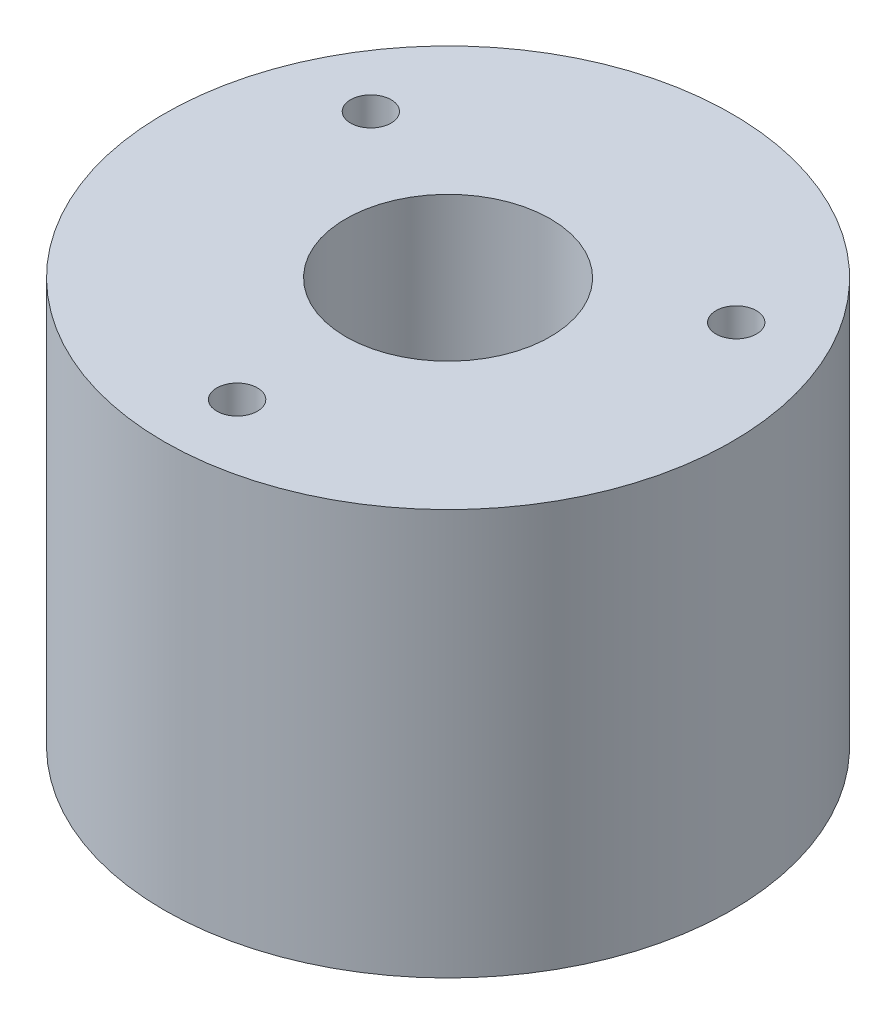
ISO-10303-21;
HEADER;
FILE_DESCRIPTION(('STEP AP214'),'2;1');
FILE_NAME('part.step','',(''),(''),'','','');
FILE_SCHEMA(('AUTOMOTIVE_DESIGN { 1 0 10303 214 1 1 1 1 }'));
ENDSEC;
DATA;
#1=APPLICATION_CONTEXT('core data for automotive mechanical design processes');
#2=APPLICATION_PROTOCOL_DEFINITION('international standard','automotive_design',2000,#1);
#3=PRODUCT_CONTEXT('',#1,'mechanical');
#4=PRODUCT('Part','Part','',(#3));
#5=PRODUCT_RELATED_PRODUCT_CATEGORY('part','',(#4));
#6=PRODUCT_DEFINITION_FORMATION('','',#4);
#7=PRODUCT_DEFINITION_CONTEXT('part definition',#1,'design');
#8=PRODUCT_DEFINITION('design','',#6,#7);
#9=PRODUCT_DEFINITION_SHAPE('','',#8);
#10=(LENGTH_UNIT() NAMED_UNIT(*) SI_UNIT(.MILLI.,.METRE.));
#11=(NAMED_UNIT(*) PLANE_ANGLE_UNIT() SI_UNIT($,.RADIAN.));
#12=(NAMED_UNIT(*) SI_UNIT($,.STERADIAN.) SOLID_ANGLE_UNIT());
#13=UNCERTAINTY_MEASURE_WITH_UNIT(LENGTH_MEASURE(1.E-05),#10,'distance_accuracy_value','');
#14=(GEOMETRIC_REPRESENTATION_CONTEXT(3) GLOBAL_UNCERTAINTY_ASSIGNED_CONTEXT((#13)) GLOBAL_UNIT_ASSIGNED_CONTEXT((#10,
#11,#12)) REPRESENTATION_CONTEXT('',''));
#15=CARTESIAN_POINT('',(0.,0.,0.));
#16=DIRECTION('',(0.,0.,1.));
#17=DIRECTION('',(1.,0.,0.));
#18=AXIS2_PLACEMENT_3D('',#15,#16,#17);
#19=CARTESIAN_POINT('',(0.,31.75,0.));
#20=DIRECTION('',(0.,-1.,0.));
#21=DIRECTION('',(0.,0.,-1.));
#22=AXIS2_PLACEMENT_3D('',#19,#20,#21);
#23=CYLINDRICAL_SURFACE('',#22,8.001);
#24=CARTESIAN_POINT('',(0.,31.75,0.));
#25=DIRECTION('',(0.,1.,0.));
#26=DIRECTION('',(0.,0.,1.));
#27=AXIS2_PLACEMENT_3D('',#24,#25,#26);
#28=CIRCLE('',#27,8.001);
#29=CARTESIAN_POINT('',(0.,31.75,8.001));
#30=VERTEX_POINT('',#29);
#31=EDGE_CURVE('E249',#30,#30,#28,.T.);
#32=ORIENTED_EDGE('',*,*,#31,.T.);
#33=EDGE_LOOP('',(#32));
#34=FACE_BOUND('',#33,.T.);
#35=CARTESIAN_POINT('',(0.,9.921875,0.));
#36=DIRECTION('',(0.,-1.,0.));
#37=DIRECTION('',(0.,0.,-1.));
#38=AXIS2_PLACEMENT_3D('',#35,#36,#37);
#39=CIRCLE('',#38,8.001);
#40=CARTESIAN_POINT('',(0.,9.921875,-8.001));
#41=VERTEX_POINT('',#40);
#42=EDGE_CURVE('E254',#41,#41,#39,.F.);
#43=ORIENTED_EDGE('',*,*,#42,.F.);
#44=EDGE_LOOP('',(#43));
#45=FACE_BOUND('',#44,.T.);
#46=ADVANCED_FACE('F45',(#34,#45),#23,.F.);
#47=CARTESIAN_POINT('',(0.,31.75,0.));
#48=DIRECTION('',(0.,1.,0.));
#49=DIRECTION('',(0.,0.,1.));
#50=AXIS2_PLACEMENT_3D('',#47,#48,#49);
#51=PLANE('',#50);
#52=CARTESIAN_POINT('',(0.,31.75,16.51));
#53=DIRECTION('',(0.,-1.,0.));
#54=DIRECTION('',(0.,0.,-1.));
#55=AXIS2_PLACEMENT_3D('',#52,#53,#54);
#56=CIRCLE('',#55,1.5875);
#57=CARTESIAN_POINT('',(0.,31.75,14.9225));
#58=VERTEX_POINT('',#57);
#59=EDGE_CURVE('E450',#58,#58,#56,.T.);
#60=ORIENTED_EDGE('',*,*,#59,.T.);
#61=EDGE_LOOP('',(#60));
#62=FACE_BOUND('',#61,.T.);
#63=CARTESIAN_POINT('',(14.2980794164811,31.75,-8.255));
#64=DIRECTION('',(0.,-1.,0.));
#65=DIRECTION('',(0.,0.,-1.));
#66=AXIS2_PLACEMENT_3D('',#63,#64,#65);
#67=CIRCLE('',#66,1.5875);
#68=CARTESIAN_POINT('',(14.2980794164811,31.75,-9.8425));
#69=VERTEX_POINT('',#68);
#70=EDGE_CURVE('E849',#69,#69,#67,.T.);
#71=ORIENTED_EDGE('',*,*,#70,.T.);
#72=EDGE_LOOP('',(#71));
#73=FACE_BOUND('',#72,.T.);
#74=CARTESIAN_POINT('',(-14.2980794164811,31.75,-8.25500000000001));
#75=DIRECTION('',(0.,-1.,0.));
#76=DIRECTION('',(0.,0.,-1.));
#77=AXIS2_PLACEMENT_3D('',#74,#75,#76);
#78=CIRCLE('',#77,1.5875);
#79=CARTESIAN_POINT('',(-14.2980794164811,31.75,-9.84250000000001));
#80=VERTEX_POINT('',#79);
#81=EDGE_CURVE('E858',#80,#80,#78,.T.);
#82=ORIENTED_EDGE('',*,*,#81,.T.);
#83=EDGE_LOOP('',(#82));
#84=FACE_BOUND('',#83,.T.);
#85=CARTESIAN_POINT('',(0.,31.75,0.));
#86=DIRECTION('',(0.,1.,0.));
#87=DIRECTION('',(0.,0.,1.));
#88=AXIS2_PLACEMENT_3D('',#85,#86,#87);
#89=CIRCLE('',#88,22.225);
#90=CARTESIAN_POINT('',(0.,31.75,22.225));
#91=VERTEX_POINT('',#90);
#92=EDGE_CURVE('E255',#91,#91,#89,.T.);
#93=ORIENTED_EDGE('',*,*,#92,.T.);
#94=EDGE_LOOP('',(#93));
#95=FACE_BOUND('',#94,.T.);
#96=ORIENTED_EDGE('',*,*,#31,.F.);
#97=EDGE_LOOP('',(#96));
#98=FACE_BOUND('',#97,.T.);
#99=ADVANCED_FACE('F504',(#62,#73,#84,#95,#98),#51,.T.);
#100=CARTESIAN_POINT('',(0.,0.,0.));
#101=DIRECTION('',(0.,1.,0.));
#102=DIRECTION('',(0.,0.,1.));
#103=AXIS2_PLACEMENT_3D('',#100,#101,#102);
#104=PLANE('',#103);
#105=CARTESIAN_POINT('',(0.,0.,16.51));
#106=DIRECTION('',(0.,-1.,0.));
#107=DIRECTION('',(0.,0.,-1.));
#108=AXIS2_PLACEMENT_3D('',#105,#106,#107);
#109=CIRCLE('',#108,1.5875);
#110=CARTESIAN_POINT('',(0.,0.,14.9225));
#111=VERTEX_POINT('',#110);
#112=EDGE_CURVE('E841',#111,#111,#109,.T.);
#113=ORIENTED_EDGE('',*,*,#112,.F.);
#114=EDGE_LOOP('',(#113));
#115=FACE_BOUND('',#114,.T.);
#116=CARTESIAN_POINT('',(14.2980794164811,0.,-8.255));
#117=DIRECTION('',(0.,-1.,0.));
#118=DIRECTION('',(0.,0.,-1.));
#119=AXIS2_PLACEMENT_3D('',#116,#117,#118);
#120=CIRCLE('',#119,1.5875);
#121=CARTESIAN_POINT('',(14.2980794164811,0.,-9.8425));
#122=VERTEX_POINT('',#121);
#123=EDGE_CURVE('E843',#122,#122,#120,.T.);
#124=ORIENTED_EDGE('',*,*,#123,.F.);
#125=EDGE_LOOP('',(#124));
#126=FACE_BOUND('',#125,.T.);
#127=CARTESIAN_POINT('',(-14.2980794164811,0.,-8.25500000000001));
#128=DIRECTION('',(0.,-1.,0.));
#129=DIRECTION('',(0.,0.,-1.));
#130=AXIS2_PLACEMENT_3D('',#127,#128,#129);
#131=CIRCLE('',#130,1.5875);
#132=CARTESIAN_POINT('',(-14.2980794164811,0.,-9.84250000000001));
#133=VERTEX_POINT('',#132);
#134=EDGE_CURVE('E855',#133,#133,#131,.T.);
#135=ORIENTED_EDGE('',*,*,#134,.F.);
#136=EDGE_LOOP('',(#135));
#137=FACE_BOUND('',#136,.T.);
#138=DIRECTION('',(0.5,0.,-0.866025403784439));
#139=VECTOR('',#138,1.);
#140=CARTESIAN_POINT('',(-10.38225,0.,-5.994194832294));
#141=LINE('',#140,#139);
#142=CARTESIAN_POINT('',(-12.0681210428597,0.,-3.07418053105195));
#143=VERTEX_POINT('',#142);
#144=CARTESIAN_POINT('',(-8.69637895714055,0.,-8.9142091335357));
#145=VERTEX_POINT('',#144);
#146=EDGE_CURVE('E225',#143,#145,#141,.T.);
#147=ORIENTED_EDGE('',*,*,#146,.F.);
#148=CARTESIAN_POINT('',(-14.8177516998752,0.,-4.66168053105195));
#149=DIRECTION('',(0.,1.,0.));
#150=DIRECTION('',(0.,0.,1.));
#151=AXIS2_PLACEMENT_3D('',#148,#149,#150);
#152=CIRCLE('',#151,3.175);
#153=CARTESIAN_POINT('',(-14.1679172332918,0.,-1.55389351035054));
#154=VERTEX_POINT('',#153);
#155=EDGE_CURVE('E207',#143,#154,#152,.F.);
#156=ORIENTED_EDGE('',*,*,#155,.T.);
#157=CARTESIAN_POINT('',(-13.843,0.,1.62196645003831E-13));
#158=DIRECTION('',(0.,-1.,0.));
#159=DIRECTION('',(0.,0.,-1.));
#160=AXIS2_PLACEMENT_3D('',#157,#158,#159);
#161=CIRCLE('',#160,1.5875);
#162=CARTESIAN_POINT('',(-14.1679172332917,0.,1.55389351035088));
#163=VERTEX_POINT('',#162);
#164=EDGE_CURVE('E238',#163,#154,#161,.T.);
#165=ORIENTED_EDGE('',*,*,#164,.F.);
#166=CARTESIAN_POINT('',(-14.817751699875,0.,4.66168053105232));
#167=DIRECTION('',(0.,1.,0.));
#168=DIRECTION('',(0.,0.,1.));
#169=AXIS2_PLACEMENT_3D('',#166,#167,#168);
#170=CIRCLE('',#169,3.175);
#171=CARTESIAN_POINT('',(-12.0681210428594,0.,3.07418053105233));
#172=VERTEX_POINT('',#171);
#173=EDGE_CURVE('E230',#163,#172,#170,.F.);
#174=ORIENTED_EDGE('',*,*,#173,.T.);
#175=DIRECTION('',(-0.5,0.,-0.866025403784439));
#176=VECTOR('',#175,1.);
#177=CARTESIAN_POINT('',(-10.38225,0.,5.99419483229399));
#178=LINE('',#177,#176);
#179=CARTESIAN_POINT('',(-8.69637895714046,0.,8.91420913353585));
#180=VERTEX_POINT('',#179);
#181=EDGE_CURVE('E245',#180,#172,#178,.T.);
#182=ORIENTED_EDGE('',*,*,#181,.F.);
#183=CARTESIAN_POINT('',(-11.4460096141561,0.,10.5017091335359));
#184=DIRECTION('',(0.,1.,0.));
#185=DIRECTION('',(0.,0.,1.));
#186=AXIS2_PLACEMENT_3D('',#183,#184,#185);
#187=CIRCLE('',#186,3.175);
#188=CARTESIAN_POINT('',(-8.42966987138535,0.,11.4928294875706));
#189=VERTEX_POINT('',#188);
#190=EDGE_CURVE('E266',#180,#189,#187,.F.);
#191=ORIENTED_EDGE('',*,*,#190,.T.);
#192=CARTESIAN_POINT('',(-6.9215,0.,11.988389664588));
#193=DIRECTION('',(0.,-1.,0.));
#194=DIRECTION('',(0.,0.,-1.));
#195=AXIS2_PLACEMENT_3D('',#192,#193,#194);
#196=CIRCLE('',#195,1.5875);
#197=CARTESIAN_POINT('',(-5.73824736190636,0.,13.0467229979213));
#198=VERTEX_POINT('',#197);
#199=EDGE_CURVE('E478',#198,#189,#196,.T.);
#200=ORIENTED_EDGE('',*,*,#199,.F.);
#201=CARTESIAN_POINT('',(-3.37174208571908,0.,15.163389664588));
#202=DIRECTION('',(0.,1.,0.));
#203=DIRECTION('',(0.,0.,1.));
#204=AXIS2_PLACEMENT_3D('',#201,#202,#203);
#205=CIRCLE('',#204,3.175);
#206=CARTESIAN_POINT('',(-3.37174208571908,0.,11.988389664588));
#207=VERTEX_POINT('',#206);
#208=EDGE_CURVE('E269',#198,#207,#205,.F.);
#209=ORIENTED_EDGE('',*,*,#208,.T.);
#210=DIRECTION('',(-1.,0.,0.));
#211=VECTOR('',#210,1.);
#212=CARTESIAN_POINT('',(0.,0.,11.988389664588));
#213=LINE('',#212,#211);
#214=CARTESIAN_POINT('',(3.37174208571913,0.,11.988389664588));
#215=VERTEX_POINT('',#214);
#216=EDGE_CURVE('E474',#215,#207,#213,.T.);
#217=ORIENTED_EDGE('',*,*,#216,.F.);
#218=CARTESIAN_POINT('',(3.37174208571913,0.,15.163389664588));
#219=DIRECTION('',(0.,1.,0.));
#220=DIRECTION('',(0.,0.,1.));
#221=AXIS2_PLACEMENT_3D('',#218,#219,#220);
#222=CIRCLE('',#221,3.175);
#223=CARTESIAN_POINT('',(5.73824736190639,0.,13.0467229979213));
#224=VERTEX_POINT('',#223);
#225=EDGE_CURVE('E272',#215,#224,#222,.F.);
#226=ORIENTED_EDGE('',*,*,#225,.T.);
#227=CARTESIAN_POINT('',(6.92150000000003,0.,11.988389664588));
#228=DIRECTION('',(0.,-1.,0.));
#229=DIRECTION('',(0.,0.,-1.));
#230=AXIS2_PLACEMENT_3D('',#227,#228,#229);
#231=CIRCLE('',#230,1.5875);
#232=CARTESIAN_POINT('',(8.42966987138538,0.,11.4928294875706));
#233=VERTEX_POINT('',#232);
#234=EDGE_CURVE('E470',#233,#224,#231,.T.);
#235=ORIENTED_EDGE('',*,*,#234,.F.);
#236=CARTESIAN_POINT('',(11.4460096141561,0.,10.5017091335358));
#237=DIRECTION('',(0.,1.,0.));
#238=DIRECTION('',(0.,0.,1.));
#239=AXIS2_PLACEMENT_3D('',#236,#237,#238);
#240=CIRCLE('',#239,3.175);
#241=CARTESIAN_POINT('',(8.69637895714048,0.,8.91420913353581));
#242=VERTEX_POINT('',#241);
#243=EDGE_CURVE('E275',#233,#242,#240,.F.);
#244=ORIENTED_EDGE('',*,*,#243,.T.);
#245=DIRECTION('',(-0.5,0.,0.866025403784439));
#246=VECTOR('',#245,1.);
#247=CARTESIAN_POINT('',(10.38225,0.,5.99419483229399));
#248=LINE('',#247,#246);
#249=CARTESIAN_POINT('',(12.0681210428596,0.,3.07418053105206));
#250=VERTEX_POINT('',#249);
#251=EDGE_CURVE('E466',#250,#242,#248,.T.);
#252=ORIENTED_EDGE('',*,*,#251,.F.);
#253=CARTESIAN_POINT('',(14.8177516998752,0.,4.66168053105206));
#254=DIRECTION('',(0.,1.,0.));
#255=DIRECTION('',(0.,0.,1.));
#256=AXIS2_PLACEMENT_3D('',#253,#254,#255);
#257=CIRCLE('',#256,3.175);
#258=CARTESIAN_POINT('',(14.1679172332917,0.,1.55389351035065));
#259=VERTEX_POINT('',#258);
#260=EDGE_CURVE('E278',#250,#259,#257,.F.);
#261=ORIENTED_EDGE('',*,*,#260,.T.);
#262=CARTESIAN_POINT('',(13.843,0.,0.));
#263=DIRECTION('',(0.,-1.,0.));
#264=DIRECTION('',(0.,0.,-1.));
#265=AXIS2_PLACEMENT_3D('',#262,#263,#264);
#266=CIRCLE('',#265,1.5875);
#267=CARTESIAN_POINT('',(14.1679172332917,0.,-1.55389351035078));
#268=VERTEX_POINT('',#267);
#269=EDGE_CURVE('E462',#268,#259,#266,.T.);
#270=ORIENTED_EDGE('',*,*,#269,.F.);
#271=CARTESIAN_POINT('',(14.8177516998751,0.,-4.66168053105221));
#272=DIRECTION('',(0.,1.,0.));
#273=DIRECTION('',(0.,0.,1.));
#274=AXIS2_PLACEMENT_3D('',#271,#272,#273);
#275=CIRCLE('',#274,3.175);
#276=CARTESIAN_POINT('',(12.0681210428595,0.,-3.07418053105221));
#277=VERTEX_POINT('',#276);
#278=EDGE_CURVE('E281',#268,#277,#275,.F.);
#279=ORIENTED_EDGE('',*,*,#278,.T.);
#280=DIRECTION('',(0.5,0.,0.866025403784439));
#281=VECTOR('',#280,1.);
#282=CARTESIAN_POINT('',(10.38225,0.,-5.99419483229399));
#283=LINE('',#282,#281);
#284=CARTESIAN_POINT('',(8.6963789571404,0.,-8.91420913353596));
#285=VERTEX_POINT('',#284);
#286=EDGE_CURVE('E458',#285,#277,#283,.T.);
#287=ORIENTED_EDGE('',*,*,#286,.F.);
#288=CARTESIAN_POINT('',(11.446009614156,0.,-10.501709133536));
#289=DIRECTION('',(0.,1.,0.));
#290=DIRECTION('',(0.,0.,1.));
#291=AXIS2_PLACEMENT_3D('',#288,#289,#290);
#292=CIRCLE('',#291,3.175);
#293=CARTESIAN_POINT('',(8.42966987138528,0.,-11.4928294875707));
#294=VERTEX_POINT('',#293);
#295=EDGE_CURVE('E284',#285,#294,#292,.F.);
#296=ORIENTED_EDGE('',*,*,#295,.T.);
#297=CARTESIAN_POINT('',(6.92149999999992,0.,-11.988389664588));
#298=DIRECTION('',(0.,-1.,0.));
#299=DIRECTION('',(0.,0.,-1.));
#300=AXIS2_PLACEMENT_3D('',#297,#298,#299);
#301=CIRCLE('',#300,1.5875);
#302=CARTESIAN_POINT('',(5.73824736190626,0.,-13.0467229979214));
#303=VERTEX_POINT('',#302);
#304=EDGE_CURVE('E454',#303,#294,#301,.T.);
#305=ORIENTED_EDGE('',*,*,#304,.F.);
#306=CARTESIAN_POINT('',(3.37174208571896,0.,-15.163389664588));
#307=DIRECTION('',(0.,1.,0.));
#308=DIRECTION('',(0.,0.,1.));
#309=AXIS2_PLACEMENT_3D('',#306,#307,#308);
#310=CIRCLE('',#309,3.175);
#311=CARTESIAN_POINT('',(3.37174208571896,0.,-11.988389664588));
#312=VERTEX_POINT('',#311);
#313=EDGE_CURVE('E287',#303,#312,#310,.F.);
#314=ORIENTED_EDGE('',*,*,#313,.T.);
#315=DIRECTION('',(1.,0.,0.));
#316=VECTOR('',#315,1.);
#317=CARTESIAN_POINT('',(0.,0.,-11.988389664588));
#318=LINE('',#317,#316);
#319=CARTESIAN_POINT('',(-3.37174208571925,0.,-11.988389664588));
#320=VERTEX_POINT('',#319);
#321=EDGE_CURVE('E449',#320,#312,#318,.T.);
#322=ORIENTED_EDGE('',*,*,#321,.F.);
#323=CARTESIAN_POINT('',(-3.37174208571925,0.,-15.163389664588));
#324=DIRECTION('',(0.,1.,0.));
#325=DIRECTION('',(0.,0.,1.));
#326=AXIS2_PLACEMENT_3D('',#323,#324,#325);
#327=CIRCLE('',#326,3.175);
#328=CARTESIAN_POINT('',(-5.73824736190649,0.,-13.0467229979213));
#329=VERTEX_POINT('',#328);
#330=EDGE_CURVE('E290',#320,#329,#327,.F.);
#331=ORIENTED_EDGE('',*,*,#330,.T.);
#332=CARTESIAN_POINT('',(-6.92150000000011,0.,-11.9883896645879));
#333=DIRECTION('',(0.,-1.,0.));
#334=DIRECTION('',(0.,0.,-1.));
#335=AXIS2_PLACEMENT_3D('',#332,#333,#334);
#336=CIRCLE('',#335,1.5875);
#337=CARTESIAN_POINT('',(-8.42966987138545,0.,-11.4928294875705));
#338=VERTEX_POINT('',#337);
#339=EDGE_CURVE('E445',#338,#329,#336,.T.);
#340=ORIENTED_EDGE('',*,*,#339,.F.);
#341=CARTESIAN_POINT('',(-11.4460096141561,0.,-10.5017091335357));
#342=DIRECTION('',(0.,1.,0.));
#343=DIRECTION('',(0.,0.,1.));
#344=AXIS2_PLACEMENT_3D('',#341,#342,#343);
#345=CIRCLE('',#344,3.175);
#346=EDGE_CURVE('E219',#338,#145,#345,.F.);
#347=ORIENTED_EDGE('',*,*,#346,.T.);
#348=EDGE_LOOP('',(#147,#156,#165,#174,#182,#191,#200,#209,#217,#226,#235,#244,#252,#261,#270,
#279,#287,#296,#305,#314,#322,#331,#340,#347));
#349=FACE_BOUND('',#348,.T.);
#350=CARTESIAN_POINT('',(0.,0.,0.));
#351=DIRECTION('',(0.,1.,0.));
#352=DIRECTION('',(0.,0.,1.));
#353=AXIS2_PLACEMENT_3D('',#350,#351,#352);
#354=CIRCLE('',#353,22.225);
#355=CARTESIAN_POINT('',(0.,0.,22.225));
#356=VERTEX_POINT('',#355);
#357=EDGE_CURVE('E253',#356,#356,#354,.T.);
#358=ORIENTED_EDGE('',*,*,#357,.F.);
#359=EDGE_LOOP('',(#358));
#360=FACE_BOUND('',#359,.T.);
#361=ADVANCED_FACE('F233',(#115,#126,#137,#349,#360),#104,.F.);
#362=CARTESIAN_POINT('',(0.,31.75,0.));
#363=DIRECTION('',(0.,-1.,0.));
#364=DIRECTION('',(0.,0.,-1.));
#365=AXIS2_PLACEMENT_3D('',#362,#363,#364);
#366=CYLINDRICAL_SURFACE('',#365,22.225);
#367=ORIENTED_EDGE('',*,*,#92,.F.);
#368=EDGE_LOOP('',(#367));
#369=FACE_BOUND('',#368,.T.);
#370=ORIENTED_EDGE('',*,*,#357,.T.);
#371=EDGE_LOOP('',(#370));
#372=FACE_BOUND('',#371,.T.);
#373=ADVANCED_FACE('F520',(#369,#372),#366,.T.);
#374=CARTESIAN_POINT('',(-6.92150000000011,9.921875,-11.9883896645879));
#375=DIRECTION('',(0.,-1.,0.));
#376=DIRECTION('',(0.,0.,-1.));
#377=AXIS2_PLACEMENT_3D('',#374,#375,#376);
#378=CYLINDRICAL_SURFACE('',#377,1.5875);
#379=CARTESIAN_POINT('',(-6.92150000000011,9.921875,-11.9883896645879));
#380=DIRECTION('',(0.,-1.,0.));
#381=DIRECTION('',(0.,0.,-1.));
#382=AXIS2_PLACEMENT_3D('',#379,#380,#381);
#383=CIRCLE('',#382,1.5875);
#384=CARTESIAN_POINT('',(-8.42966987138545,9.921875,-11.4928294875705));
#385=VERTEX_POINT('',#384);
#386=CARTESIAN_POINT('',(-5.73824736190649,9.921875,-13.0467229979213));
#387=VERTEX_POINT('',#386);
#388=EDGE_CURVE('E237',#385,#387,#383,.T.);
#389=ORIENTED_EDGE('',*,*,#388,.F.);
#390=DIRECTION('',(0.,-1.,0.));
#391=VECTOR('',#390,1.);
#392=CARTESIAN_POINT('',(-8.42966987138545,9.921875,-11.4928294875705));
#393=LINE('',#392,#391);
#394=EDGE_CURVE('E303',#385,#338,#393,.T.);
#395=ORIENTED_EDGE('',*,*,#394,.T.);
#396=ORIENTED_EDGE('',*,*,#339,.T.);
#397=DIRECTION('',(0.,-1.,0.));
#398=VECTOR('',#397,1.);
#399=CARTESIAN_POINT('',(-5.73824736190649,9.921875,-13.0467229979213));
#400=LINE('',#399,#398);
#401=EDGE_CURVE('E300',#329,#387,#400,.F.);
#402=ORIENTED_EDGE('',*,*,#401,.T.);
#403=EDGE_LOOP('',(#389,#395,#396,#402));
#404=FACE_BOUND('',#403,.T.);
#405=ADVANCED_FACE('F501',(#404),#378,.F.);
#406=CARTESIAN_POINT('',(-10.38225,9.921875,-5.994194832294));
#407=DIRECTION('',(-0.866025403784439,0.,-0.5));
#408=DIRECTION('',(-0.5,0.,0.866025403784439));
#409=AXIS2_PLACEMENT_3D('',#406,#407,#408);
#410=PLANE('',#409);
#411=DIRECTION('',(0.5,0.,-0.866025403784439));
#412=VECTOR('',#411,1.);
#413=CARTESIAN_POINT('',(-10.38225,9.921875,-5.994194832294));
#414=LINE('',#413,#412);
#415=CARTESIAN_POINT('',(-12.0681210428597,9.921875,-3.07418053105195));
#416=VERTEX_POINT('',#415);
#417=CARTESIAN_POINT('',(-8.69637895714055,9.921875,-8.9142091335357));
#418=VERTEX_POINT('',#417);
#419=EDGE_CURVE('E228',#416,#418,#414,.T.);
#420=ORIENTED_EDGE('',*,*,#419,.F.);
#421=DIRECTION('',(0.,-1.,0.));
#422=VECTOR('',#421,1.);
#423=CARTESIAN_POINT('',(-12.0681210428597,9.921875,-3.07418053105195));
#424=LINE('',#423,#422);
#425=EDGE_CURVE('E211',#416,#143,#424,.T.);
#426=ORIENTED_EDGE('',*,*,#425,.T.);
#427=ORIENTED_EDGE('',*,*,#146,.T.);
#428=DIRECTION('',(0.,-1.,0.));
#429=VECTOR('',#428,1.);
#430=CARTESIAN_POINT('',(-8.69637895714055,9.921875,-8.9142091335357));
#431=LINE('',#430,#429);
#432=EDGE_CURVE('E231',#145,#418,#431,.F.);
#433=ORIENTED_EDGE('',*,*,#432,.T.);
#434=EDGE_LOOP('',(#420,#426,#427,#433));
#435=FACE_BOUND('',#434,.T.);
#436=ADVANCED_FACE('F224',(#435),#410,.F.);
#437=CARTESIAN_POINT('',(-13.843,9.921875,1.62196645003831E-13));
#438=DIRECTION('',(0.,-1.,0.));
#439=DIRECTION('',(0.,0.,-1.));
#440=AXIS2_PLACEMENT_3D('',#437,#438,#439);
#441=CYLINDRICAL_SURFACE('',#440,1.5875);
#442=ORIENTED_EDGE('',*,*,#164,.T.);
#443=DIRECTION('',(0.,-1.,0.));
#444=VECTOR('',#443,1.);
#445=CARTESIAN_POINT('',(-14.1679172332918,9.921875,-1.55389351035054));
#446=LINE('',#445,#444);
#447=CARTESIAN_POINT('',(-14.1679172332918,9.921875,-1.55389351035054));
#448=VERTEX_POINT('',#447);
#449=EDGE_CURVE('E212',#154,#448,#446,.F.);
#450=ORIENTED_EDGE('',*,*,#449,.T.);
#451=CARTESIAN_POINT('',(-13.843,9.921875,1.62196645003831E-13));
#452=DIRECTION('',(0.,-1.,0.));
#453=DIRECTION('',(0.,0.,-1.));
#454=AXIS2_PLACEMENT_3D('',#451,#452,#453);
#455=CIRCLE('',#454,1.5875);
#456=CARTESIAN_POINT('',(-14.1679172332917,9.921875,1.55389351035088));
#457=VERTEX_POINT('',#456);
#458=EDGE_CURVE('E404',#457,#448,#455,.T.);
#459=ORIENTED_EDGE('',*,*,#458,.F.);
#460=DIRECTION('',(0.,-1.,0.));
#461=VECTOR('',#460,1.);
#462=CARTESIAN_POINT('',(-14.1679172332917,9.921875,1.55389351035088));
#463=LINE('',#462,#461);
#464=EDGE_CURVE('E218',#457,#163,#463,.T.);
#465=ORIENTED_EDGE('',*,*,#464,.T.);
#466=EDGE_LOOP('',(#442,#450,#459,#465));
#467=FACE_BOUND('',#466,.T.);
#468=ADVANCED_FACE('F492',(#467),#441,.F.);
#469=CARTESIAN_POINT('',(-10.38225,9.921875,5.99419483229399));
#470=DIRECTION('',(-0.866025403784439,0.,0.5));
#471=DIRECTION('',(0.5,0.,0.866025403784439));
#472=AXIS2_PLACEMENT_3D('',#469,#470,#471);
#473=PLANE('',#472);
#474=DIRECTION('',(-0.5,0.,-0.866025403784439));
#475=VECTOR('',#474,1.);
#476=CARTESIAN_POINT('',(-10.38225,9.921875,5.99419483229399));
#477=LINE('',#476,#475);
#478=CARTESIAN_POINT('',(-8.69637895714046,9.921875,8.91420913353585));
#479=VERTEX_POINT('',#478);
#480=CARTESIAN_POINT('',(-12.0681210428594,9.921875,3.07418053105233));
#481=VERTEX_POINT('',#480);
#482=EDGE_CURVE('E408',#479,#481,#477,.T.);
#483=ORIENTED_EDGE('',*,*,#482,.F.);
#484=DIRECTION('',(0.,-1.,0.));
#485=VECTOR('',#484,1.);
#486=CARTESIAN_POINT('',(-8.69637895714046,9.921875,8.91420913353585));
#487=LINE('',#486,#485);
#488=EDGE_CURVE('E365',#479,#180,#487,.T.);
#489=ORIENTED_EDGE('',*,*,#488,.T.);
#490=ORIENTED_EDGE('',*,*,#181,.T.);
#491=DIRECTION('',(0.,-1.,0.));
#492=VECTOR('',#491,1.);
#493=CARTESIAN_POINT('',(-12.0681210428594,9.921875,3.07418053105233));
#494=LINE('',#493,#492);
#495=EDGE_CURVE('E61',#172,#481,#494,.F.);
#496=ORIENTED_EDGE('',*,*,#495,.T.);
#497=EDGE_LOOP('',(#483,#489,#490,#496));
#498=FACE_BOUND('',#497,.T.);
#499=ADVANCED_FACE('F483',(#498),#473,.F.);
#500=CARTESIAN_POINT('',(-6.9215,9.921875,11.988389664588));
#501=DIRECTION('',(0.,-1.,0.));
#502=DIRECTION('',(0.,0.,-1.));
#503=AXIS2_PLACEMENT_3D('',#500,#501,#502);
#504=CYLINDRICAL_SURFACE('',#503,1.5875);
#505=CARTESIAN_POINT('',(-6.9215,9.921875,11.988389664588));
#506=DIRECTION('',(0.,-1.,0.));
#507=DIRECTION('',(0.,0.,-1.));
#508=AXIS2_PLACEMENT_3D('',#505,#506,#507);
#509=CIRCLE('',#508,1.5875);
#510=CARTESIAN_POINT('',(-5.73824736190636,9.921875,13.0467229979213));
#511=VERTEX_POINT('',#510);
#512=CARTESIAN_POINT('',(-8.42966987138535,9.921875,11.4928294875706));
#513=VERTEX_POINT('',#512);
#514=EDGE_CURVE('E411',#511,#513,#509,.T.);
#515=ORIENTED_EDGE('',*,*,#514,.F.);
#516=DIRECTION('',(0.,-1.,0.));
#517=VECTOR('',#516,1.);
#518=CARTESIAN_POINT('',(-5.73824736190636,9.921875,13.0467229979213));
#519=LINE('',#518,#517);
#520=EDGE_CURVE('E359',#511,#198,#519,.T.);
#521=ORIENTED_EDGE('',*,*,#520,.T.);
#522=ORIENTED_EDGE('',*,*,#199,.T.);
#523=DIRECTION('',(0.,-1.,0.));
#524=VECTOR('',#523,1.);
#525=CARTESIAN_POINT('',(-8.42966987138535,9.921875,11.4928294875706));
#526=LINE('',#525,#524);
#527=EDGE_CURVE('E356',#189,#513,#526,.F.);
#528=ORIENTED_EDGE('',*,*,#527,.T.);
#529=EDGE_LOOP('',(#515,#521,#522,#528));
#530=FACE_BOUND('',#529,.T.);
#531=ADVANCED_FACE('F499',(#530),#504,.F.);
#532=CARTESIAN_POINT('',(0.,9.921875,11.988389664588));
#533=DIRECTION('',(0.,0.,1.));
#534=DIRECTION('',(1.,0.,0.));
#535=AXIS2_PLACEMENT_3D('',#532,#533,#534);
#536=PLANE('',#535);
#537=DIRECTION('',(-1.,0.,0.));
#538=VECTOR('',#537,1.);
#539=CARTESIAN_POINT('',(0.,9.921875,11.988389664588));
#540=LINE('',#539,#538);
#541=CARTESIAN_POINT('',(3.37174208571913,9.921875,11.988389664588));
#542=VERTEX_POINT('',#541);
#543=CARTESIAN_POINT('',(-3.37174208571908,9.921875,11.988389664588));
#544=VERTEX_POINT('',#543);
#545=EDGE_CURVE('E414',#542,#544,#540,.T.);
#546=ORIENTED_EDGE('',*,*,#545,.F.);
#547=DIRECTION('',(0.,-1.,0.));
#548=VECTOR('',#547,1.);
#549=CARTESIAN_POINT('',(3.37174208571913,9.921875,11.988389664588));
#550=LINE('',#549,#548);
#551=EDGE_CURVE('E352',#542,#215,#550,.T.);
#552=ORIENTED_EDGE('',*,*,#551,.T.);
#553=ORIENTED_EDGE('',*,*,#216,.T.);
#554=DIRECTION('',(0.,-1.,0.));
#555=VECTOR('',#554,1.);
#556=CARTESIAN_POINT('',(-3.37174208571908,9.921875,11.988389664588));
#557=LINE('',#556,#555);
#558=EDGE_CURVE('E349',#207,#544,#557,.F.);
#559=ORIENTED_EDGE('',*,*,#558,.T.);
#560=EDGE_LOOP('',(#546,#552,#553,#559));
#561=FACE_BOUND('',#560,.T.);
#562=ADVANCED_FACE('F578',(#561),#536,.F.);
#563=CARTESIAN_POINT('',(6.92150000000003,9.921875,11.988389664588));
#564=DIRECTION('',(0.,-1.,0.));
#565=DIRECTION('',(0.,0.,-1.));
#566=AXIS2_PLACEMENT_3D('',#563,#564,#565);
#567=CYLINDRICAL_SURFACE('',#566,1.5875);
#568=CARTESIAN_POINT('',(6.92150000000003,9.921875,11.988389664588));
#569=DIRECTION('',(0.,-1.,0.));
#570=DIRECTION('',(0.,0.,-1.));
#571=AXIS2_PLACEMENT_3D('',#568,#569,#570);
#572=CIRCLE('',#571,1.5875);
#573=CARTESIAN_POINT('',(8.42966987138538,9.921875,11.4928294875706));
#574=VERTEX_POINT('',#573);
#575=CARTESIAN_POINT('',(5.73824736190639,9.921875,13.0467229979213));
#576=VERTEX_POINT('',#575);
#577=EDGE_CURVE('E418',#574,#576,#572,.T.);
#578=ORIENTED_EDGE('',*,*,#577,.F.);
#579=DIRECTION('',(0.,-1.,0.));
#580=VECTOR('',#579,1.);
#581=CARTESIAN_POINT('',(8.42966987138538,9.921875,11.4928294875706));
#582=LINE('',#581,#580);
#583=EDGE_CURVE('E345',#574,#233,#582,.T.);
#584=ORIENTED_EDGE('',*,*,#583,.T.);
#585=ORIENTED_EDGE('',*,*,#234,.T.);
#586=DIRECTION('',(0.,-1.,0.));
#587=VECTOR('',#586,1.);
#588=CARTESIAN_POINT('',(5.7382473619064,9.921875,13.0467229979213));
#589=LINE('',#588,#587);
#590=EDGE_CURVE('E342',#224,#576,#589,.F.);
#591=ORIENTED_EDGE('',*,*,#590,.T.);
#592=EDGE_LOOP('',(#578,#584,#585,#591));
#593=FACE_BOUND('',#592,.T.);
#594=ADVANCED_FACE('F585',(#593),#567,.F.);
#595=CARTESIAN_POINT('',(10.38225,9.921875,5.99419483229399));
#596=DIRECTION('',(0.866025403784439,0.,0.5));
#597=DIRECTION('',(0.5,0.,-0.866025403784439));
#598=AXIS2_PLACEMENT_3D('',#595,#596,#597);
#599=PLANE('',#598);
#600=DIRECTION('',(-0.5,0.,0.866025403784439));
#601=VECTOR('',#600,1.);
#602=CARTESIAN_POINT('',(10.38225,9.921875,5.99419483229399));
#603=LINE('',#602,#601);
#604=CARTESIAN_POINT('',(12.0681210428596,9.921875,3.07418053105206));
#605=VERTEX_POINT('',#604);
#606=CARTESIAN_POINT('',(8.69637895714048,9.921875,8.91420913353581));
#607=VERTEX_POINT('',#606);
#608=EDGE_CURVE('E422',#605,#607,#603,.T.);
#609=ORIENTED_EDGE('',*,*,#608,.F.);
#610=DIRECTION('',(0.,-1.,0.));
#611=VECTOR('',#610,1.);
#612=CARTESIAN_POINT('',(12.0681210428596,9.921875,3.07418053105206));
#613=LINE('',#612,#611);
#614=EDGE_CURVE('E338',#605,#250,#613,.T.);
#615=ORIENTED_EDGE('',*,*,#614,.T.);
#616=ORIENTED_EDGE('',*,*,#251,.T.);
#617=DIRECTION('',(0.,-1.,0.));
#618=VECTOR('',#617,1.);
#619=CARTESIAN_POINT('',(8.69637895714048,9.921875,8.91420913353581));
#620=LINE('',#619,#618);
#621=EDGE_CURVE('E335',#242,#607,#620,.F.);
#622=ORIENTED_EDGE('',*,*,#621,.T.);
#623=EDGE_LOOP('',(#609,#615,#616,#622));
#624=FACE_BOUND('',#623,.T.);
#625=ADVANCED_FACE('F592',(#624),#599,.F.);
#626=CARTESIAN_POINT('',(13.843,9.921875,0.));
#627=DIRECTION('',(0.,-1.,0.));
#628=DIRECTION('',(0.,0.,-1.));
#629=AXIS2_PLACEMENT_3D('',#626,#627,#628);
#630=CYLINDRICAL_SURFACE('',#629,1.5875);
#631=CARTESIAN_POINT('',(13.843,9.921875,0.));
#632=DIRECTION('',(0.,-1.,0.));
#633=DIRECTION('',(0.,0.,-1.));
#634=AXIS2_PLACEMENT_3D('',#631,#632,#633);
#635=CIRCLE('',#634,1.5875);
#636=CARTESIAN_POINT('',(14.1679172332917,9.921875,-1.55389351035078));
#637=VERTEX_POINT('',#636);
#638=CARTESIAN_POINT('',(14.1679172332917,9.921875,1.55389351035065));
#639=VERTEX_POINT('',#638);
#640=EDGE_CURVE('E426',#637,#639,#635,.T.);
#641=ORIENTED_EDGE('',*,*,#640,.F.);
#642=DIRECTION('',(0.,-1.,0.));
#643=VECTOR('',#642,1.);
#644=CARTESIAN_POINT('',(14.1679172332917,9.921875,-1.55389351035078));
#645=LINE('',#644,#643);
#646=EDGE_CURVE('E331',#637,#268,#645,.T.);
#647=ORIENTED_EDGE('',*,*,#646,.T.);
#648=ORIENTED_EDGE('',*,*,#269,.T.);
#649=DIRECTION('',(0.,-1.,0.));
#650=VECTOR('',#649,1.);
#651=CARTESIAN_POINT('',(14.1679172332917,9.921875,1.55389351035065));
#652=LINE('',#651,#650);
#653=EDGE_CURVE('E328',#259,#639,#652,.F.);
#654=ORIENTED_EDGE('',*,*,#653,.T.);
#655=EDGE_LOOP('',(#641,#647,#648,#654));
#656=FACE_BOUND('',#655,.T.);
#657=ADVANCED_FACE('F599',(#656),#630,.F.);
#658=CARTESIAN_POINT('',(10.38225,9.921875,-5.99419483229399));
#659=DIRECTION('',(0.866025403784439,0.,-0.5));
#660=DIRECTION('',(-0.5,0.,-0.866025403784439));
#661=AXIS2_PLACEMENT_3D('',#658,#659,#660);
#662=PLANE('',#661);
#663=DIRECTION('',(0.5,0.,0.866025403784439));
#664=VECTOR('',#663,1.);
#665=CARTESIAN_POINT('',(10.38225,9.921875,-5.99419483229399));
#666=LINE('',#665,#664);
#667=CARTESIAN_POINT('',(8.6963789571404,9.921875,-8.91420913353596));
#668=VERTEX_POINT('',#667);
#669=CARTESIAN_POINT('',(12.0681210428595,9.921875,-3.07418053105221));
#670=VERTEX_POINT('',#669);
#671=EDGE_CURVE('E430',#668,#670,#666,.T.);
#672=ORIENTED_EDGE('',*,*,#671,.F.);
#673=DIRECTION('',(0.,-1.,0.));
#674=VECTOR('',#673,1.);
#675=CARTESIAN_POINT('',(8.6963789571404,9.921875,-8.91420913353596));
#676=LINE('',#675,#674);
#677=EDGE_CURVE('E324',#668,#285,#676,.T.);
#678=ORIENTED_EDGE('',*,*,#677,.T.);
#679=ORIENTED_EDGE('',*,*,#286,.T.);
#680=DIRECTION('',(0.,-1.,0.));
#681=VECTOR('',#680,1.);
#682=CARTESIAN_POINT('',(12.0681210428595,9.921875,-3.07418053105221));
#683=LINE('',#682,#681);
#684=EDGE_CURVE('E321',#277,#670,#683,.F.);
#685=ORIENTED_EDGE('',*,*,#684,.T.);
#686=EDGE_LOOP('',(#672,#678,#679,#685));
#687=FACE_BOUND('',#686,.T.);
#688=ADVANCED_FACE('F606',(#687),#662,.F.);
#689=CARTESIAN_POINT('',(6.92149999999992,9.921875,-11.988389664588));
#690=DIRECTION('',(0.,-1.,0.));
#691=DIRECTION('',(0.,0.,-1.));
#692=AXIS2_PLACEMENT_3D('',#689,#690,#691);
#693=CYLINDRICAL_SURFACE('',#692,1.5875);
#694=CARTESIAN_POINT('',(6.92149999999992,9.921875,-11.988389664588));
#695=DIRECTION('',(0.,-1.,0.));
#696=DIRECTION('',(0.,0.,-1.));
#697=AXIS2_PLACEMENT_3D('',#694,#695,#696);
#698=CIRCLE('',#697,1.5875);
#699=CARTESIAN_POINT('',(5.73824736190626,9.921875,-13.0467229979214));
#700=VERTEX_POINT('',#699);
#701=CARTESIAN_POINT('',(8.42966987138528,9.921875,-11.4928294875707));
#702=VERTEX_POINT('',#701);
#703=EDGE_CURVE('E434',#700,#702,#698,.T.);
#704=ORIENTED_EDGE('',*,*,#703,.F.);
#705=DIRECTION('',(0.,-1.,0.));
#706=VECTOR('',#705,1.);
#707=CARTESIAN_POINT('',(5.73824736190627,9.921875,-13.0467229979214));
#708=LINE('',#707,#706);
#709=EDGE_CURVE('E317',#700,#303,#708,.T.);
#710=ORIENTED_EDGE('',*,*,#709,.T.);
#711=ORIENTED_EDGE('',*,*,#304,.T.);
#712=DIRECTION('',(0.,-1.,0.));
#713=VECTOR('',#712,1.);
#714=CARTESIAN_POINT('',(8.42966987138528,9.921875,-11.4928294875707));
#715=LINE('',#714,#713);
#716=EDGE_CURVE('E314',#294,#702,#715,.F.);
#717=ORIENTED_EDGE('',*,*,#716,.T.);
#718=EDGE_LOOP('',(#704,#710,#711,#717));
#719=FACE_BOUND('',#718,.T.);
#720=ADVANCED_FACE('F613',(#719),#693,.F.);
#721=CARTESIAN_POINT('',(0.,9.921875,-11.988389664588));
#722=DIRECTION('',(0.,0.,-1.));
#723=DIRECTION('',(-1.,0.,0.));
#724=AXIS2_PLACEMENT_3D('',#721,#722,#723);
#725=PLANE('',#724);
#726=DIRECTION('',(1.,0.,0.));
#727=VECTOR('',#726,1.);
#728=CARTESIAN_POINT('',(0.,9.921875,-11.988389664588));
#729=LINE('',#728,#727);
#730=CARTESIAN_POINT('',(-3.37174208571925,9.921875,-11.988389664588));
#731=VERTEX_POINT('',#730);
#732=CARTESIAN_POINT('',(3.37174208571896,9.921875,-11.988389664588));
#733=VERTEX_POINT('',#732);
#734=EDGE_CURVE('E243',#731,#733,#729,.T.);
#735=ORIENTED_EDGE('',*,*,#734,.F.);
#736=DIRECTION('',(0.,-1.,0.));
#737=VECTOR('',#736,1.);
#738=CARTESIAN_POINT('',(-3.37174208571925,9.921875,-11.988389664588));
#739=LINE('',#738,#737);
#740=EDGE_CURVE('E310',#731,#320,#739,.T.);
#741=ORIENTED_EDGE('',*,*,#740,.T.);
#742=ORIENTED_EDGE('',*,*,#321,.T.);
#743=DIRECTION('',(0.,-1.,0.));
#744=VECTOR('',#743,1.);
#745=CARTESIAN_POINT('',(3.37174208571896,9.921875,-11.988389664588));
#746=LINE('',#745,#744);
#747=EDGE_CURVE('E307',#312,#733,#746,.F.);
#748=ORIENTED_EDGE('',*,*,#747,.T.);
#749=EDGE_LOOP('',(#735,#741,#742,#748));
#750=FACE_BOUND('',#749,.T.);
#751=ADVANCED_FACE('F618',(#750),#725,.F.);
#752=CARTESIAN_POINT('',(0.,9.921875,0.));
#753=DIRECTION('',(0.,-1.,0.));
#754=DIRECTION('',(0.,0.,-1.));
#755=AXIS2_PLACEMENT_3D('',#752,#753,#754);
#756=PLANE('',#755);
#757=ORIENTED_EDGE('',*,*,#419,.T.);
#758=CARTESIAN_POINT('',(-11.4460096141561,9.921875,-10.5017091335357));
#759=DIRECTION('',(0.,-1.,0.));
#760=DIRECTION('',(0.,0.,-1.));
#761=AXIS2_PLACEMENT_3D('',#758,#759,#760);
#762=CIRCLE('',#761,3.175);
#763=EDGE_CURVE('E372',#418,#385,#762,.F.);
#764=ORIENTED_EDGE('',*,*,#763,.T.);
#765=ORIENTED_EDGE('',*,*,#388,.T.);
#766=CARTESIAN_POINT('',(-3.37174208571925,9.921875,-15.163389664588));
#767=DIRECTION('',(0.,-1.,0.));
#768=DIRECTION('',(0.,0.,-1.));
#769=AXIS2_PLACEMENT_3D('',#766,#767,#768);
#770=CIRCLE('',#769,3.175);
#771=EDGE_CURVE('E375',#387,#731,#770,.F.);
#772=ORIENTED_EDGE('',*,*,#771,.T.);
#773=ORIENTED_EDGE('',*,*,#734,.T.);
#774=CARTESIAN_POINT('',(3.37174208571896,9.921875,-15.163389664588));
#775=DIRECTION('',(0.,-1.,0.));
#776=DIRECTION('',(0.,0.,-1.));
#777=AXIS2_PLACEMENT_3D('',#774,#775,#776);
#778=CIRCLE('',#777,3.175);
#779=EDGE_CURVE('E378',#733,#700,#778,.F.);
#780=ORIENTED_EDGE('',*,*,#779,.T.);
#781=ORIENTED_EDGE('',*,*,#703,.T.);
#782=CARTESIAN_POINT('',(11.446009614156,9.921875,-10.501709133536));
#783=DIRECTION('',(0.,-1.,0.));
#784=DIRECTION('',(0.,0.,-1.));
#785=AXIS2_PLACEMENT_3D('',#782,#783,#784);
#786=CIRCLE('',#785,3.175);
#787=EDGE_CURVE('E381',#702,#668,#786,.F.);
#788=ORIENTED_EDGE('',*,*,#787,.T.);
#789=ORIENTED_EDGE('',*,*,#671,.T.);
#790=CARTESIAN_POINT('',(14.8177516998751,9.921875,-4.66168053105221));
#791=DIRECTION('',(0.,-1.,0.));
#792=DIRECTION('',(0.,0.,-1.));
#793=AXIS2_PLACEMENT_3D('',#790,#791,#792);
#794=CIRCLE('',#793,3.175);
#795=EDGE_CURVE('E384',#670,#637,#794,.F.);
#796=ORIENTED_EDGE('',*,*,#795,.T.);
#797=ORIENTED_EDGE('',*,*,#640,.T.);
#798=CARTESIAN_POINT('',(14.8177516998752,9.921875,4.66168053105206));
#799=DIRECTION('',(0.,-1.,0.));
#800=DIRECTION('',(0.,0.,-1.));
#801=AXIS2_PLACEMENT_3D('',#798,#799,#800);
#802=CIRCLE('',#801,3.175);
#803=EDGE_CURVE('E387',#639,#605,#802,.F.);
#804=ORIENTED_EDGE('',*,*,#803,.T.);
#805=ORIENTED_EDGE('',*,*,#608,.T.);
#806=CARTESIAN_POINT('',(11.4460096141561,9.921875,10.5017091335358));
#807=DIRECTION('',(0.,-1.,0.));
#808=DIRECTION('',(0.,0.,-1.));
#809=AXIS2_PLACEMENT_3D('',#806,#807,#808);
#810=CIRCLE('',#809,3.175);
#811=EDGE_CURVE('E390',#607,#574,#810,.F.);
#812=ORIENTED_EDGE('',*,*,#811,.T.);
#813=ORIENTED_EDGE('',*,*,#577,.T.);
#814=CARTESIAN_POINT('',(3.37174208571913,9.921875,15.163389664588));
#815=DIRECTION('',(0.,-1.,0.));
#816=DIRECTION('',(0.,0.,-1.));
#817=AXIS2_PLACEMENT_3D('',#814,#815,#816);
#818=CIRCLE('',#817,3.175);
#819=EDGE_CURVE('E393',#576,#542,#818,.F.);
#820=ORIENTED_EDGE('',*,*,#819,.T.);
#821=ORIENTED_EDGE('',*,*,#545,.T.);
#822=CARTESIAN_POINT('',(-3.37174208571908,9.921875,15.163389664588));
#823=DIRECTION('',(0.,-1.,0.));
#824=DIRECTION('',(0.,0.,-1.));
#825=AXIS2_PLACEMENT_3D('',#822,#823,#824);
#826=CIRCLE('',#825,3.175);
#827=EDGE_CURVE('E396',#544,#511,#826,.F.);
#828=ORIENTED_EDGE('',*,*,#827,.T.);
#829=ORIENTED_EDGE('',*,*,#514,.T.);
#830=CARTESIAN_POINT('',(-11.4460096141561,9.921875,10.5017091335359));
#831=DIRECTION('',(0.,-1.,0.));
#832=DIRECTION('',(0.,0.,-1.));
#833=AXIS2_PLACEMENT_3D('',#830,#831,#832);
#834=CIRCLE('',#833,3.175);
#835=EDGE_CURVE('E54',#513,#479,#834,.F.);
#836=ORIENTED_EDGE('',*,*,#835,.T.);
#837=ORIENTED_EDGE('',*,*,#482,.T.);
#838=CARTESIAN_POINT('',(-14.817751699875,9.921875,4.66168053105232));
#839=DIRECTION('',(0.,-1.,0.));
#840=DIRECTION('',(0.,0.,-1.));
#841=AXIS2_PLACEMENT_3D('',#838,#839,#840);
#842=CIRCLE('',#841,3.175);
#843=EDGE_CURVE('E11',#481,#457,#842,.F.);
#844=ORIENTED_EDGE('',*,*,#843,.T.);
#845=ORIENTED_EDGE('',*,*,#458,.T.);
#846=CARTESIAN_POINT('',(-14.8177516998752,9.921875,-4.66168053105195));
#847=DIRECTION('',(0.,-1.,0.));
#848=DIRECTION('',(0.,0.,-1.));
#849=AXIS2_PLACEMENT_3D('',#846,#847,#848);
#850=CIRCLE('',#849,3.175);
#851=EDGE_CURVE('E369',#448,#416,#850,.F.);
#852=ORIENTED_EDGE('',*,*,#851,.T.);
#853=EDGE_LOOP('',(#757,#764,#765,#772,#773,#780,#781,#788,#789,#796,#797,#804,#805,#812,#813,
#820,#821,#828,#829,#836,#837,#844,#845,#852));
#854=FACE_BOUND('',#853,.T.);
#855=ORIENTED_EDGE('',*,*,#42,.T.);
#856=EDGE_LOOP('',(#855));
#857=FACE_BOUND('',#856,.T.);
#858=ADVANCED_FACE('F489',(#854,#857),#756,.T.);
#859=CARTESIAN_POINT('',(-14.8177516998752,9.921875,-4.66168053105195));
#860=DIRECTION('',(0.,-1.,0.));
#861=DIRECTION('',(0.,0.,-1.));
#862=AXIS2_PLACEMENT_3D('',#859,#860,#861);
#863=CYLINDRICAL_SURFACE('',#862,3.175);
#864=ORIENTED_EDGE('',*,*,#851,.F.);
#865=ORIENTED_EDGE('',*,*,#449,.F.);
#866=ORIENTED_EDGE('',*,*,#155,.F.);
#867=ORIENTED_EDGE('',*,*,#425,.F.);
#868=EDGE_LOOP('',(#864,#865,#866,#867));
#869=FACE_BOUND('',#868,.T.);
#870=ADVANCED_FACE('F210',(#869),#863,.T.);
#871=CARTESIAN_POINT('',(-11.4460096141561,9.921875,-10.5017091335357));
#872=DIRECTION('',(0.,-1.,0.));
#873=DIRECTION('',(0.,0.,-1.));
#874=AXIS2_PLACEMENT_3D('',#871,#872,#873);
#875=CYLINDRICAL_SURFACE('',#874,3.175);
#876=ORIENTED_EDGE('',*,*,#763,.F.);
#877=ORIENTED_EDGE('',*,*,#432,.F.);
#878=ORIENTED_EDGE('',*,*,#346,.F.);
#879=ORIENTED_EDGE('',*,*,#394,.F.);
#880=EDGE_LOOP('',(#876,#877,#878,#879));
#881=FACE_BOUND('',#880,.T.);
#882=ADVANCED_FACE('F526',(#881),#875,.T.);
#883=CARTESIAN_POINT('',(-3.37174208571925,9.921875,-15.163389664588));
#884=DIRECTION('',(0.,-1.,0.));
#885=DIRECTION('',(0.,0.,-1.));
#886=AXIS2_PLACEMENT_3D('',#883,#884,#885);
#887=CYLINDRICAL_SURFACE('',#886,3.175);
#888=ORIENTED_EDGE('',*,*,#771,.F.);
#889=ORIENTED_EDGE('',*,*,#401,.F.);
#890=ORIENTED_EDGE('',*,*,#330,.F.);
#891=ORIENTED_EDGE('',*,*,#740,.F.);
#892=EDGE_LOOP('',(#888,#889,#890,#891));
#893=FACE_BOUND('',#892,.T.);
#894=ADVANCED_FACE('F529',(#893),#887,.T.);
#895=CARTESIAN_POINT('',(3.37174208571896,9.921875,-15.163389664588));
#896=DIRECTION('',(0.,-1.,0.));
#897=DIRECTION('',(0.,0.,-1.));
#898=AXIS2_PLACEMENT_3D('',#895,#896,#897);
#899=CYLINDRICAL_SURFACE('',#898,3.175);
#900=ORIENTED_EDGE('',*,*,#779,.F.);
#901=ORIENTED_EDGE('',*,*,#747,.F.);
#902=ORIENTED_EDGE('',*,*,#313,.F.);
#903=ORIENTED_EDGE('',*,*,#709,.F.);
#904=EDGE_LOOP('',(#900,#901,#902,#903));
#905=FACE_BOUND('',#904,.T.);
#906=ADVANCED_FACE('F533',(#905),#899,.T.);
#907=CARTESIAN_POINT('',(11.446009614156,9.921875,-10.501709133536));
#908=DIRECTION('',(0.,-1.,0.));
#909=DIRECTION('',(0.,0.,-1.));
#910=AXIS2_PLACEMENT_3D('',#907,#908,#909);
#911=CYLINDRICAL_SURFACE('',#910,3.175);
#912=ORIENTED_EDGE('',*,*,#787,.F.);
#913=ORIENTED_EDGE('',*,*,#716,.F.);
#914=ORIENTED_EDGE('',*,*,#295,.F.);
#915=ORIENTED_EDGE('',*,*,#677,.F.);
#916=EDGE_LOOP('',(#912,#913,#914,#915));
#917=FACE_BOUND('',#916,.T.);
#918=ADVANCED_FACE('F537',(#917),#911,.T.);
#919=CARTESIAN_POINT('',(14.8177516998751,9.921875,-4.66168053105221));
#920=DIRECTION('',(0.,-1.,0.));
#921=DIRECTION('',(0.,0.,-1.));
#922=AXIS2_PLACEMENT_3D('',#919,#920,#921);
#923=CYLINDRICAL_SURFACE('',#922,3.175);
#924=ORIENTED_EDGE('',*,*,#795,.F.);
#925=ORIENTED_EDGE('',*,*,#684,.F.);
#926=ORIENTED_EDGE('',*,*,#278,.F.);
#927=ORIENTED_EDGE('',*,*,#646,.F.);
#928=EDGE_LOOP('',(#924,#925,#926,#927));
#929=FACE_BOUND('',#928,.T.);
#930=ADVANCED_FACE('F541',(#929),#923,.T.);
#931=CARTESIAN_POINT('',(14.8177516998752,9.921875,4.66168053105206));
#932=DIRECTION('',(0.,-1.,0.));
#933=DIRECTION('',(0.,0.,-1.));
#934=AXIS2_PLACEMENT_3D('',#931,#932,#933);
#935=CYLINDRICAL_SURFACE('',#934,3.175);
#936=ORIENTED_EDGE('',*,*,#803,.F.);
#937=ORIENTED_EDGE('',*,*,#653,.F.);
#938=ORIENTED_EDGE('',*,*,#260,.F.);
#939=ORIENTED_EDGE('',*,*,#614,.F.);
#940=EDGE_LOOP('',(#936,#937,#938,#939));
#941=FACE_BOUND('',#940,.T.);
#942=ADVANCED_FACE('F545',(#941),#935,.T.);
#943=CARTESIAN_POINT('',(11.4460096141561,9.921875,10.5017091335358));
#944=DIRECTION('',(0.,-1.,0.));
#945=DIRECTION('',(0.,0.,-1.));
#946=AXIS2_PLACEMENT_3D('',#943,#944,#945);
#947=CYLINDRICAL_SURFACE('',#946,3.175);
#948=ORIENTED_EDGE('',*,*,#811,.F.);
#949=ORIENTED_EDGE('',*,*,#621,.F.);
#950=ORIENTED_EDGE('',*,*,#243,.F.);
#951=ORIENTED_EDGE('',*,*,#583,.F.);
#952=EDGE_LOOP('',(#948,#949,#950,#951));
#953=FACE_BOUND('',#952,.T.);
#954=ADVANCED_FACE('F549',(#953),#947,.T.);
#955=CARTESIAN_POINT('',(3.37174208571913,9.921875,15.163389664588));
#956=DIRECTION('',(0.,-1.,0.));
#957=DIRECTION('',(0.,0.,-1.));
#958=AXIS2_PLACEMENT_3D('',#955,#956,#957);
#959=CYLINDRICAL_SURFACE('',#958,3.175);
#960=ORIENTED_EDGE('',*,*,#819,.F.);
#961=ORIENTED_EDGE('',*,*,#590,.F.);
#962=ORIENTED_EDGE('',*,*,#225,.F.);
#963=ORIENTED_EDGE('',*,*,#551,.F.);
#964=EDGE_LOOP('',(#960,#961,#962,#963));
#965=FACE_BOUND('',#964,.T.);
#966=ADVANCED_FACE('F553',(#965),#959,.T.);
#967=CARTESIAN_POINT('',(-3.37174208571908,9.921875,15.163389664588));
#968=DIRECTION('',(0.,-1.,0.));
#969=DIRECTION('',(0.,0.,-1.));
#970=AXIS2_PLACEMENT_3D('',#967,#968,#969);
#971=CYLINDRICAL_SURFACE('',#970,3.175);
#972=ORIENTED_EDGE('',*,*,#827,.F.);
#973=ORIENTED_EDGE('',*,*,#558,.F.);
#974=ORIENTED_EDGE('',*,*,#208,.F.);
#975=ORIENTED_EDGE('',*,*,#520,.F.);
#976=EDGE_LOOP('',(#972,#973,#974,#975));
#977=FACE_BOUND('',#976,.T.);
#978=ADVANCED_FACE('F557',(#977),#971,.T.);
#979=CARTESIAN_POINT('',(-11.4460096141561,9.921875,10.5017091335359));
#980=DIRECTION('',(0.,-1.,0.));
#981=DIRECTION('',(0.,0.,-1.));
#982=AXIS2_PLACEMENT_3D('',#979,#980,#981);
#983=CYLINDRICAL_SURFACE('',#982,3.175);
#984=ORIENTED_EDGE('',*,*,#835,.F.);
#985=ORIENTED_EDGE('',*,*,#527,.F.);
#986=ORIENTED_EDGE('',*,*,#190,.F.);
#987=ORIENTED_EDGE('',*,*,#488,.F.);
#988=EDGE_LOOP('',(#984,#985,#986,#987));
#989=FACE_BOUND('',#988,.T.);
#990=ADVANCED_FACE('F560',(#989),#983,.T.);
#991=CARTESIAN_POINT('',(-14.817751699875,9.921875,4.66168053105232));
#992=DIRECTION('',(0.,-1.,0.));
#993=DIRECTION('',(0.,0.,-1.));
#994=AXIS2_PLACEMENT_3D('',#991,#992,#993);
#995=CYLINDRICAL_SURFACE('',#994,3.175);
#996=ORIENTED_EDGE('',*,*,#843,.F.);
#997=ORIENTED_EDGE('',*,*,#495,.F.);
#998=ORIENTED_EDGE('',*,*,#173,.F.);
#999=ORIENTED_EDGE('',*,*,#464,.F.);
#1000=EDGE_LOOP('',(#996,#997,#998,#999));
#1001=FACE_BOUND('',#1000,.T.);
#1002=ADVANCED_FACE('F47',(#1001),#995,.T.);
#1003=CARTESIAN_POINT('',(-14.2980794164811,31.75,-8.25500000000001));
#1004=DIRECTION('',(0.,-1.,0.));
#1005=DIRECTION('',(0.,0.,-1.));
#1006=AXIS2_PLACEMENT_3D('',#1003,#1004,#1005);
#1007=CYLINDRICAL_SURFACE('',#1006,1.5875);
#1008=ORIENTED_EDGE('',*,*,#81,.F.);
#1009=EDGE_LOOP('',(#1008));
#1010=FACE_BOUND('',#1009,.T.);
#1011=ORIENTED_EDGE('',*,*,#134,.T.);
#1012=EDGE_LOOP('',(#1011));
#1013=FACE_BOUND('',#1012,.T.);
#1014=ADVANCED_FACE('F567',(#1010,#1013),#1007,.F.);
#1015=CARTESIAN_POINT('',(14.2980794164811,31.75,-8.255));
#1016=DIRECTION('',(0.,-1.,0.));
#1017=DIRECTION('',(0.,0.,-1.));
#1018=AXIS2_PLACEMENT_3D('',#1015,#1016,#1017);
#1019=CYLINDRICAL_SURFACE('',#1018,1.5875);
#1020=ORIENTED_EDGE('',*,*,#70,.F.);
#1021=EDGE_LOOP('',(#1020));
#1022=FACE_BOUND('',#1021,.T.);
#1023=ORIENTED_EDGE('',*,*,#123,.T.);
#1024=EDGE_LOOP('',(#1023));
#1025=FACE_BOUND('',#1024,.T.);
#1026=ADVANCED_FACE('F813',(#1022,#1025),#1019,.F.);
#1027=CARTESIAN_POINT('',(0.,31.75,16.51));
#1028=DIRECTION('',(0.,-1.,0.));
#1029=DIRECTION('',(0.,0.,-1.));
#1030=AXIS2_PLACEMENT_3D('',#1027,#1028,#1029);
#1031=CYLINDRICAL_SURFACE('',#1030,1.5875);
#1032=ORIENTED_EDGE('',*,*,#59,.F.);
#1033=EDGE_LOOP('',(#1032));
#1034=FACE_BOUND('',#1033,.T.);
#1035=ORIENTED_EDGE('',*,*,#112,.T.);
#1036=EDGE_LOOP('',(#1035));
#1037=FACE_BOUND('',#1036,.T.);
#1038=ADVANCED_FACE('F823',(#1034,#1037),#1031,.F.);
#1039=CLOSED_SHELL('',(#46,#99,#361,#373,#405,#436,#468,#499,#531,#562,#594,#625,#657,#688,#720,
#751,#858,#870,#882,#894,#906,#918,#930,#942,#954,#966,#978,#990,#1002,#1014,#1026,#1038));
#1040=MANIFOLD_SOLID_BREP('B2',#1039);
#1041=ADVANCED_BREP_SHAPE_REPRESENTATION('',(#18,#1040),#14);
#1042=SHAPE_DEFINITION_REPRESENTATION(#9,#1041);
ENDSEC;
END-ISO-10303-21;
